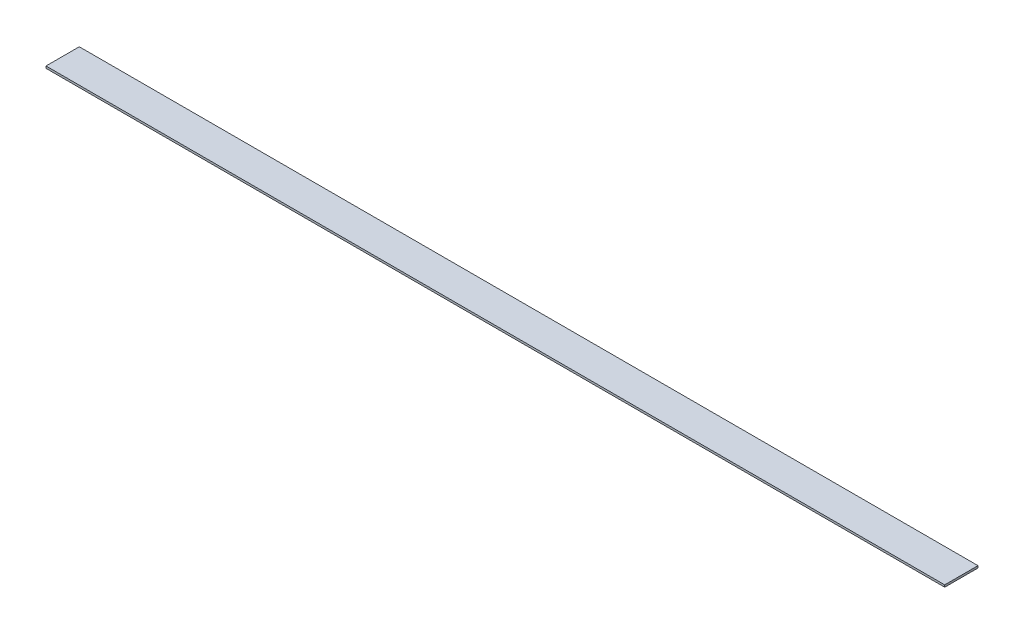
ISO-10303-21;
HEADER;
FILE_DESCRIPTION(('STEP AP214'),'2;1');
FILE_NAME('part.step','',(''),(''),'','','');
FILE_SCHEMA(('AUTOMOTIVE_DESIGN { 1 0 10303 214 1 1 1 1 }'));
ENDSEC;
DATA;
#1=APPLICATION_CONTEXT('core data for automotive mechanical design processes');
#2=APPLICATION_PROTOCOL_DEFINITION('international standard','automotive_design',2000,#1);
#3=PRODUCT_CONTEXT('',#1,'mechanical');
#4=PRODUCT('Part','Part','',(#3));
#5=PRODUCT_RELATED_PRODUCT_CATEGORY('part','',(#4));
#6=PRODUCT_DEFINITION_FORMATION('','',#4);
#7=PRODUCT_DEFINITION_CONTEXT('part definition',#1,'design');
#8=PRODUCT_DEFINITION('design','',#6,#7);
#9=PRODUCT_DEFINITION_SHAPE('','',#8);
#10=(LENGTH_UNIT() NAMED_UNIT(*) SI_UNIT(.MILLI.,.METRE.));
#11=(NAMED_UNIT(*) PLANE_ANGLE_UNIT() SI_UNIT($,.RADIAN.));
#12=(NAMED_UNIT(*) SI_UNIT($,.STERADIAN.) SOLID_ANGLE_UNIT());
#13=UNCERTAINTY_MEASURE_WITH_UNIT(LENGTH_MEASURE(1.E-05),#10,'distance_accuracy_value','');
#14=(GEOMETRIC_REPRESENTATION_CONTEXT(3) GLOBAL_UNCERTAINTY_ASSIGNED_CONTEXT((#13)) GLOBAL_UNIT_ASSIGNED_CONTEXT((#10,
#11,#12)) REPRESENTATION_CONTEXT('',''));
#15=CARTESIAN_POINT('',(0.,0.,0.));
#16=DIRECTION('',(0.,0.,1.));
#17=DIRECTION('',(1.,0.,0.));
#18=AXIS2_PLACEMENT_3D('',#15,#16,#17);
#19=CARTESIAN_POINT('',(342.9,1.5875,-12.7));
#20=DIRECTION('',(-1.,0.,0.));
#21=DIRECTION('',(0.,0.,1.));
#22=AXIS2_PLACEMENT_3D('',#19,#20,#21);
#23=PLANE('',#22);
#24=DIRECTION('',(0.,0.,-1.));
#25=VECTOR('',#24,1.);
#26=CARTESIAN_POINT('',(342.9,0.,-12.7));
#27=LINE('',#26,#25);
#28=CARTESIAN_POINT('',(342.9,0.,12.7));
#29=VERTEX_POINT('',#28);
#30=CARTESIAN_POINT('',(342.9,0.,-12.7));
#31=VERTEX_POINT('',#30);
#32=EDGE_CURVE('E98',#29,#31,#27,.T.);
#33=ORIENTED_EDGE('',*,*,#32,.T.);
#34=DIRECTION('',(0.,-1.,0.));
#35=VECTOR('',#34,1.);
#36=CARTESIAN_POINT('',(342.9,1.5875,-12.7));
#37=LINE('',#36,#35);
#38=CARTESIAN_POINT('',(342.9,1.5875,-12.7));
#39=VERTEX_POINT('',#38);
#40=EDGE_CURVE('E11',#39,#31,#37,.T.);
#41=ORIENTED_EDGE('',*,*,#40,.F.);
#42=DIRECTION('',(0.,0.,-1.));
#43=VECTOR('',#42,1.);
#44=CARTESIAN_POINT('',(342.9,1.5875,-12.7));
#45=LINE('',#44,#43);
#46=CARTESIAN_POINT('',(342.9,1.5875,12.7));
#47=VERTEX_POINT('',#46);
#48=EDGE_CURVE('E86',#47,#39,#45,.T.);
#49=ORIENTED_EDGE('',*,*,#48,.F.);
#50=DIRECTION('',(0.,-1.,0.));
#51=VECTOR('',#50,1.);
#52=CARTESIAN_POINT('',(342.9,1.5875,12.7));
#53=LINE('',#52,#51);
#54=EDGE_CURVE('E94',#47,#29,#53,.T.);
#55=ORIENTED_EDGE('',*,*,#54,.T.);
#56=EDGE_LOOP('',(#33,#41,#49,#55));
#57=FACE_BOUND('',#56,.T.);
#58=ADVANCED_FACE('F35',(#57),#23,.F.);
#59=CARTESIAN_POINT('',(-342.9,1.5875,-12.7));
#60=DIRECTION('',(0.,0.,1.));
#61=DIRECTION('',(1.,0.,0.));
#62=AXIS2_PLACEMENT_3D('',#59,#60,#61);
#63=PLANE('',#62);
#64=DIRECTION('',(-1.,0.,0.));
#65=VECTOR('',#64,1.);
#66=CARTESIAN_POINT('',(-342.9,0.,-12.7));
#67=LINE('',#66,#65);
#68=CARTESIAN_POINT('',(-342.9,0.,-12.7));
#69=VERTEX_POINT('',#68);
#70=EDGE_CURVE('E90',#31,#69,#67,.T.);
#71=ORIENTED_EDGE('',*,*,#70,.T.);
#72=DIRECTION('',(0.,-1.,0.));
#73=VECTOR('',#72,1.);
#74=CARTESIAN_POINT('',(-342.9,1.5875,-12.7));
#75=LINE('',#74,#73);
#76=CARTESIAN_POINT('',(-342.9,1.5875,-12.7));
#77=VERTEX_POINT('',#76);
#78=EDGE_CURVE('E43',#77,#69,#75,.T.);
#79=ORIENTED_EDGE('',*,*,#78,.F.);
#80=DIRECTION('',(-1.,0.,0.));
#81=VECTOR('',#80,1.);
#82=CARTESIAN_POINT('',(-342.9,1.5875,-12.7));
#83=LINE('',#82,#81);
#84=EDGE_CURVE('E81',#39,#77,#83,.T.);
#85=ORIENTED_EDGE('',*,*,#84,.F.);
#86=ORIENTED_EDGE('',*,*,#40,.T.);
#87=EDGE_LOOP('',(#71,#79,#85,#86));
#88=FACE_BOUND('',#87,.T.);
#89=ADVANCED_FACE('F89',(#88),#63,.F.);
#90=CARTESIAN_POINT('',(-342.9,1.5875,-12.7));
#91=DIRECTION('',(1.,0.,0.));
#92=DIRECTION('',(0.,0.,-1.));
#93=AXIS2_PLACEMENT_3D('',#90,#91,#92);
#94=PLANE('',#93);
#95=DIRECTION('',(0.,0.,1.));
#96=VECTOR('',#95,1.);
#97=CARTESIAN_POINT('',(-342.9,0.,-12.7));
#98=LINE('',#97,#96);
#99=CARTESIAN_POINT('',(-342.9,0.,12.7));
#100=VERTEX_POINT('',#99);
#101=EDGE_CURVE('E68',#69,#100,#98,.T.);
#102=ORIENTED_EDGE('',*,*,#101,.T.);
#103=DIRECTION('',(0.,-1.,0.));
#104=VECTOR('',#103,1.);
#105=CARTESIAN_POINT('',(-342.9,1.5875,12.7));
#106=LINE('',#105,#104);
#107=CARTESIAN_POINT('',(-342.9,1.5875,12.7));
#108=VERTEX_POINT('',#107);
#109=EDGE_CURVE('E91',#108,#100,#106,.T.);
#110=ORIENTED_EDGE('',*,*,#109,.F.);
#111=DIRECTION('',(0.,0.,1.));
#112=VECTOR('',#111,1.);
#113=CARTESIAN_POINT('',(-342.9,1.5875,-12.7));
#114=LINE('',#113,#112);
#115=EDGE_CURVE('E84',#77,#108,#114,.T.);
#116=ORIENTED_EDGE('',*,*,#115,.F.);
#117=ORIENTED_EDGE('',*,*,#78,.T.);
#118=EDGE_LOOP('',(#102,#110,#116,#117));
#119=FACE_BOUND('',#118,.T.);
#120=ADVANCED_FACE('F92',(#119),#94,.F.);
#121=CARTESIAN_POINT('',(-342.9,1.5875,12.7));
#122=DIRECTION('',(0.,0.,-1.));
#123=DIRECTION('',(-1.,0.,0.));
#124=AXIS2_PLACEMENT_3D('',#121,#122,#123);
#125=PLANE('',#124);
#126=DIRECTION('',(1.,0.,0.));
#127=VECTOR('',#126,1.);
#128=CARTESIAN_POINT('',(-342.9,0.,12.7));
#129=LINE('',#128,#127);
#130=EDGE_CURVE('E74',#100,#29,#129,.T.);
#131=ORIENTED_EDGE('',*,*,#130,.T.);
#132=ORIENTED_EDGE('',*,*,#54,.F.);
#133=DIRECTION('',(1.,0.,0.));
#134=VECTOR('',#133,1.);
#135=CARTESIAN_POINT('',(-342.9,1.5875,12.7));
#136=LINE('',#135,#134);
#137=EDGE_CURVE('E51',#108,#47,#136,.T.);
#138=ORIENTED_EDGE('',*,*,#137,.F.);
#139=ORIENTED_EDGE('',*,*,#109,.T.);
#140=EDGE_LOOP('',(#131,#132,#138,#139));
#141=FACE_BOUND('',#140,.T.);
#142=ADVANCED_FACE('F105',(#141),#125,.F.);
#143=CARTESIAN_POINT('',(0.,1.5875,0.));
#144=DIRECTION('',(0.,1.,0.));
#145=DIRECTION('',(0.,0.,1.));
#146=AXIS2_PLACEMENT_3D('',#143,#144,#145);
#147=PLANE('',#146);
#148=ORIENTED_EDGE('',*,*,#48,.T.);
#149=ORIENTED_EDGE('',*,*,#84,.T.);
#150=ORIENTED_EDGE('',*,*,#115,.T.);
#151=ORIENTED_EDGE('',*,*,#137,.T.);
#152=EDGE_LOOP('',(#148,#149,#150,#151));
#153=FACE_BOUND('',#152,.T.);
#154=ADVANCED_FACE('F82',(#153),#147,.T.);
#155=CARTESIAN_POINT('',(0.,0.,0.));
#156=DIRECTION('',(0.,1.,0.));
#157=DIRECTION('',(0.,0.,1.));
#158=AXIS2_PLACEMENT_3D('',#155,#156,#157);
#159=PLANE('',#158);
#160=ORIENTED_EDGE('',*,*,#32,.F.);
#161=ORIENTED_EDGE('',*,*,#130,.F.);
#162=ORIENTED_EDGE('',*,*,#101,.F.);
#163=ORIENTED_EDGE('',*,*,#70,.F.);
#164=EDGE_LOOP('',(#160,#161,#162,#163));
#165=FACE_BOUND('',#164,.T.);
#166=ADVANCED_FACE('F108',(#165),#159,.F.);
#167=CLOSED_SHELL('',(#58,#89,#120,#142,#154,#166));
#168=MANIFOLD_SOLID_BREP('B2',#167);
#169=ADVANCED_BREP_SHAPE_REPRESENTATION('',(#18,#168),#14);
#170=SHAPE_DEFINITION_REPRESENTATION(#9,#169);
ENDSEC;
END-ISO-10303-21;
